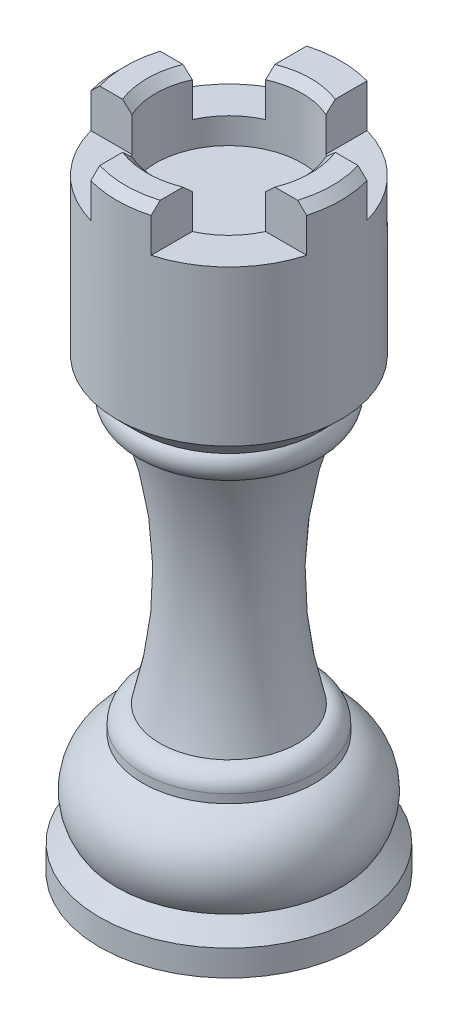
ISO-10303-21;
HEADER;
FILE_DESCRIPTION(('STEP AP214'),'2;1');
FILE_NAME('part.step','',(''),(''),'','','');
FILE_SCHEMA(('AUTOMOTIVE_DESIGN { 1 0 10303 214 1 1 1 1 }'));
ENDSEC;
DATA;
#1=APPLICATION_CONTEXT('core data for automotive mechanical design processes');
#2=APPLICATION_PROTOCOL_DEFINITION('international standard','automotive_design',2000,#1);
#3=PRODUCT_CONTEXT('',#1,'mechanical');
#4=PRODUCT('Part','Part','',(#3));
#5=PRODUCT_RELATED_PRODUCT_CATEGORY('part','',(#4));
#6=PRODUCT_DEFINITION_FORMATION('','',#4);
#7=PRODUCT_DEFINITION_CONTEXT('part definition',#1,'design');
#8=PRODUCT_DEFINITION('design','',#6,#7);
#9=PRODUCT_DEFINITION_SHAPE('','',#8);
#10=(LENGTH_UNIT() NAMED_UNIT(*) SI_UNIT(.MILLI.,.METRE.));
#11=(NAMED_UNIT(*) PLANE_ANGLE_UNIT() SI_UNIT($,.RADIAN.));
#12=(NAMED_UNIT(*) SI_UNIT($,.STERADIAN.) SOLID_ANGLE_UNIT());
#13=UNCERTAINTY_MEASURE_WITH_UNIT(LENGTH_MEASURE(1.E-05),#10,'distance_accuracy_value','');
#14=(GEOMETRIC_REPRESENTATION_CONTEXT(3) GLOBAL_UNCERTAINTY_ASSIGNED_CONTEXT((#13)) GLOBAL_UNIT_ASSIGNED_CONTEXT((#10,
#11,#12)) REPRESENTATION_CONTEXT('',''));
#15=CARTESIAN_POINT('',(0.,0.,0.));
#16=DIRECTION('',(0.,0.,1.));
#17=DIRECTION('',(1.,0.,0.));
#18=AXIS2_PLACEMENT_3D('',#15,#16,#17);
#19=CARTESIAN_POINT('',(-13.,75.,0.));
#20=DIRECTION('',(0.,1.,0.));
#21=DIRECTION('',(0.,0.,1.));
#22=AXIS2_PLACEMENT_3D('',#19,#20,#21);
#23=PLANE('',#22);
#24=DIRECTION('',(1.,0.,0.));
#25=VECTOR('',#24,1.);
#26=CARTESIAN_POINT('',(12.5199840255489,75.,-3.5));
#27=LINE('',#26,#25);
#28=CARTESIAN_POINT('',(8.83176086632786,75.,-3.5));
#29=VERTEX_POINT('',#28);
#30=CARTESIAN_POINT('',(11.478240283249,75.,-3.5));
#31=VERTEX_POINT('',#30);
#32=EDGE_CURVE('E262',#29,#31,#27,.T.);
#33=ORIENTED_EDGE('',*,*,#32,.F.);
#34=CARTESIAN_POINT('',(0.,75.,0.));
#35=DIRECTION('',(0.,1.,0.));
#36=DIRECTION('',(0.,0.,1.));
#37=AXIS2_PLACEMENT_3D('',#34,#35,#36);
#38=CIRCLE('',#37,9.50000000000001);
#39=CARTESIAN_POINT('',(8.83176086632786,75.,3.5));
#40=VERTEX_POINT('',#39);
#41=EDGE_CURVE('E577',#29,#40,#38,.F.);
#42=ORIENTED_EDGE('',*,*,#41,.T.);
#43=DIRECTION('',(-1.,0.,0.));
#44=VECTOR('',#43,1.);
#45=CARTESIAN_POINT('',(7.74596669241484,75.,3.5));
#46=LINE('',#45,#44);
#47=CARTESIAN_POINT('',(11.478240283249,75.,3.5));
#48=VERTEX_POINT('',#47);
#49=EDGE_CURVE('E233',#48,#40,#46,.T.);
#50=ORIENTED_EDGE('',*,*,#49,.F.);
#51=CARTESIAN_POINT('',(0.,75.,0.));
#52=DIRECTION('',(0.,1.,0.));
#53=DIRECTION('',(0.,0.,1.));
#54=AXIS2_PLACEMENT_3D('',#51,#52,#53);
#55=CIRCLE('',#54,12.);
#56=EDGE_CURVE('E413',#48,#31,#55,.T.);
#57=ORIENTED_EDGE('',*,*,#56,.T.);
#58=EDGE_LOOP('',(#33,#42,#50,#57));
#59=FACE_BOUND('',#58,.T.);
#60=ADVANCED_FACE('F34',(#59),#23,.T.);
#61=DIRECTION('',(0.,0.,-1.));
#62=VECTOR('',#61,1.);
#63=CARTESIAN_POINT('',(-3.5,75.,-12.5199840255489));
#64=LINE('',#63,#62);
#65=CARTESIAN_POINT('',(-3.5,75.,-8.83176086632786));
#66=VERTEX_POINT('',#65);
#67=CARTESIAN_POINT('',(-3.5,75.,-12.5199840255489));
#68=VERTEX_POINT('',#67);
#69=EDGE_CURVE('E288',#66,#68,#64,.T.);
#70=ORIENTED_EDGE('',*,*,#69,.F.);
#71=CARTESIAN_POINT('',(0.,75.,0.));
#72=DIRECTION('',(0.,1.,0.));
#73=DIRECTION('',(0.,0.,1.));
#74=AXIS2_PLACEMENT_3D('',#71,#72,#73);
#75=CIRCLE('',#74,9.50000000000001);
#76=CARTESIAN_POINT('',(3.5,75.,-8.83176086632785));
#77=VERTEX_POINT('',#76);
#78=EDGE_CURVE('E448',#66,#77,#75,.F.);
#79=ORIENTED_EDGE('',*,*,#78,.T.);
#80=DIRECTION('',(0.,0.,1.));
#81=VECTOR('',#80,1.);
#82=CARTESIAN_POINT('',(3.5,75.,-12.5199840255489));
#83=LINE('',#82,#81);
#84=CARTESIAN_POINT('',(3.5,75.,-12.5199840255489));
#85=VERTEX_POINT('',#84);
#86=EDGE_CURVE('E270',#85,#77,#83,.T.);
#87=ORIENTED_EDGE('',*,*,#86,.F.);
#88=CARTESIAN_POINT('',(0.,75.,0.));
#89=DIRECTION('',(0.,1.,0.));
#90=DIRECTION('',(0.,0.,1.));
#91=AXIS2_PLACEMENT_3D('',#88,#89,#90);
#92=CIRCLE('',#91,13.);
#93=EDGE_CURVE('E337',#85,#68,#92,.T.);
#94=ORIENTED_EDGE('',*,*,#93,.T.);
#95=EDGE_LOOP('',(#70,#79,#87,#94));
#96=FACE_BOUND('',#95,.T.);
#97=ADVANCED_FACE('F552',(#96),#23,.T.);
#98=DIRECTION('',(-1.,0.,0.));
#99=VECTOR('',#98,1.);
#100=CARTESIAN_POINT('',(-12.5199840255489,75.,3.5));
#101=LINE('',#100,#99);
#102=CARTESIAN_POINT('',(-8.83176086632787,75.,3.5));
#103=VERTEX_POINT('',#102);
#104=CARTESIAN_POINT('',(-11.478240283249,75.,3.5));
#105=VERTEX_POINT('',#104);
#106=EDGE_CURVE('E216',#103,#105,#101,.T.);
#107=ORIENTED_EDGE('',*,*,#106,.F.);
#108=CARTESIAN_POINT('',(0.,75.,0.));
#109=DIRECTION('',(0.,1.,0.));
#110=DIRECTION('',(0.,0.,1.));
#111=AXIS2_PLACEMENT_3D('',#108,#109,#110);
#112=CIRCLE('',#111,9.50000000000002);
#113=CARTESIAN_POINT('',(-8.83176086632787,75.,-3.5));
#114=VERTEX_POINT('',#113);
#115=EDGE_CURVE('E55',#103,#114,#112,.F.);
#116=ORIENTED_EDGE('',*,*,#115,.T.);
#117=DIRECTION('',(1.,0.,0.));
#118=VECTOR('',#117,1.);
#119=CARTESIAN_POINT('',(-12.5199840255489,75.,-3.5));
#120=LINE('',#119,#118);
#121=CARTESIAN_POINT('',(-11.478240283249,75.,-3.5));
#122=VERTEX_POINT('',#121);
#123=EDGE_CURVE('E296',#122,#114,#120,.T.);
#124=ORIENTED_EDGE('',*,*,#123,.F.);
#125=CARTESIAN_POINT('',(0.,75.,0.));
#126=DIRECTION('',(0.,1.,0.));
#127=DIRECTION('',(0.,0.,1.));
#128=AXIS2_PLACEMENT_3D('',#125,#126,#127);
#129=CIRCLE('',#128,12.);
#130=EDGE_CURVE('E470',#122,#105,#129,.T.);
#131=ORIENTED_EDGE('',*,*,#130,.T.);
#132=EDGE_LOOP('',(#107,#116,#124,#131));
#133=FACE_BOUND('',#132,.T.);
#134=ADVANCED_FACE('F537',(#133),#23,.T.);
#135=CARTESIAN_POINT('',(0.,67.,0.));
#136=DIRECTION('',(0.,1.,0.));
#137=DIRECTION('',(0.,0.,1.));
#138=AXIS2_PLACEMENT_3D('',#135,#136,#137);
#139=PLANE('',#138);
#140=CARTESIAN_POINT('',(0.,67.,0.));
#141=DIRECTION('',(0.,1.,0.));
#142=DIRECTION('',(0.,0.,1.));
#143=AXIS2_PLACEMENT_3D('',#140,#141,#142);
#144=CIRCLE('',#143,8.50000000000001);
#145=CARTESIAN_POINT('',(0.,67.,8.50000000000001));
#146=VERTEX_POINT('',#145);
#147=EDGE_CURVE('E340',#146,#146,#144,.T.);
#148=ORIENTED_EDGE('',*,*,#147,.T.);
#149=EDGE_LOOP('',(#148));
#150=FACE_BOUND('',#149,.T.);
#151=ADVANCED_FACE('F605',(#150),#139,.T.);
#152=CARTESIAN_POINT('',(0.,78.146546409638,0.));
#153=DIRECTION('',(0.,1.,0.));
#154=DIRECTION('',(0.,0.,1.));
#155=AXIS2_PLACEMENT_3D('',#152,#153,#154);
#156=CYLINDRICAL_SURFACE('',#155,8.50000000000001);
#157=DIRECTION('',(0.,1.,0.));
#158=VECTOR('',#157,1.);
#159=CARTESIAN_POINT('',(-3.5,70.,7.74596669241483));
#160=LINE('',#159,#158);
#161=CARTESIAN_POINT('',(-3.5,70.,7.74596669241483));
#162=VERTEX_POINT('',#161);
#163=CARTESIAN_POINT('',(-3.5,74.,7.74596669241483));
#164=VERTEX_POINT('',#163);
#165=EDGE_CURVE('E203',#162,#164,#160,.T.);
#166=ORIENTED_EDGE('',*,*,#165,.T.);
#167=CARTESIAN_POINT('',(0.,74.,0.));
#168=DIRECTION('',(0.,1.,0.));
#169=DIRECTION('',(0.,0.,1.));
#170=AXIS2_PLACEMENT_3D('',#167,#168,#169);
#171=CIRCLE('',#170,8.50000000000001);
#172=CARTESIAN_POINT('',(3.5,74.,7.74596669241483));
#173=VERTEX_POINT('',#172);
#174=EDGE_CURVE('E352',#164,#173,#171,.T.);
#175=ORIENTED_EDGE('',*,*,#174,.T.);
#176=DIRECTION('',(0.,1.,0.));
#177=VECTOR('',#176,1.);
#178=CARTESIAN_POINT('',(3.5,70.,7.74596669241483));
#179=LINE('',#178,#177);
#180=CARTESIAN_POINT('',(3.5,70.,7.74596669241483));
#181=VERTEX_POINT('',#180);
#182=EDGE_CURVE('E240',#181,#173,#179,.T.);
#183=ORIENTED_EDGE('',*,*,#182,.F.);
#184=CARTESIAN_POINT('',(0.,70.,0.));
#185=DIRECTION('',(0.,-1.,0.));
#186=DIRECTION('',(0.,0.,1.));
#187=AXIS2_PLACEMENT_3D('',#184,#185,#186);
#188=CIRCLE('',#187,8.5);
#189=CARTESIAN_POINT('',(7.74596669241484,70.,3.5));
#190=VERTEX_POINT('',#189);
#191=EDGE_CURVE('E229',#190,#181,#188,.T.);
#192=ORIENTED_EDGE('',*,*,#191,.F.);
#193=DIRECTION('',(0.,1.,0.));
#194=VECTOR('',#193,1.);
#195=CARTESIAN_POINT('',(7.74596669241484,70.,3.5));
#196=LINE('',#195,#194);
#197=CARTESIAN_POINT('',(7.74596669241484,74.,3.5));
#198=VERTEX_POINT('',#197);
#199=EDGE_CURVE('E247',#190,#198,#196,.T.);
#200=ORIENTED_EDGE('',*,*,#199,.T.);
#201=CARTESIAN_POINT('',(0.,74.,0.));
#202=DIRECTION('',(0.,1.,0.));
#203=DIRECTION('',(0.,0.,1.));
#204=AXIS2_PLACEMENT_3D('',#201,#202,#203);
#205=CIRCLE('',#204,8.50000000000001);
#206=CARTESIAN_POINT('',(7.74596669241483,74.,-3.5));
#207=VERTEX_POINT('',#206);
#208=EDGE_CURVE('E349',#198,#207,#205,.T.);
#209=ORIENTED_EDGE('',*,*,#208,.T.);
#210=DIRECTION('',(0.,1.,0.));
#211=VECTOR('',#210,1.);
#212=CARTESIAN_POINT('',(7.74596669241483,70.,-3.5));
#213=LINE('',#212,#211);
#214=CARTESIAN_POINT('',(7.74596669241483,70.,-3.5));
#215=VERTEX_POINT('',#214);
#216=EDGE_CURVE('E277',#215,#207,#213,.T.);
#217=ORIENTED_EDGE('',*,*,#216,.F.);
#218=CARTESIAN_POINT('',(0.,70.,0.));
#219=DIRECTION('',(0.,-1.,0.));
#220=DIRECTION('',(0.,0.,1.));
#221=AXIS2_PLACEMENT_3D('',#218,#219,#220);
#222=CIRCLE('',#221,8.5);
#223=CARTESIAN_POINT('',(3.5,70.,-7.74596669241483));
#224=VERTEX_POINT('',#223);
#225=EDGE_CURVE('E265',#224,#215,#222,.T.);
#226=ORIENTED_EDGE('',*,*,#225,.F.);
#227=DIRECTION('',(0.,1.,0.));
#228=VECTOR('',#227,1.);
#229=CARTESIAN_POINT('',(3.5,70.,-7.74596669241483));
#230=LINE('',#229,#228);
#231=CARTESIAN_POINT('',(3.5,74.,-7.74596669241483));
#232=VERTEX_POINT('',#231);
#233=EDGE_CURVE('E280',#224,#232,#230,.T.);
#234=ORIENTED_EDGE('',*,*,#233,.T.);
#235=CARTESIAN_POINT('',(0.,74.,0.));
#236=DIRECTION('',(0.,1.,0.));
#237=DIRECTION('',(0.,0.,1.));
#238=AXIS2_PLACEMENT_3D('',#235,#236,#237);
#239=CIRCLE('',#238,8.50000000000001);
#240=CARTESIAN_POINT('',(-3.5,74.,-7.74596669241483));
#241=VERTEX_POINT('',#240);
#242=EDGE_CURVE('E346',#232,#241,#239,.T.);
#243=ORIENTED_EDGE('',*,*,#242,.T.);
#244=DIRECTION('',(0.,1.,0.));
#245=VECTOR('',#244,1.);
#246=CARTESIAN_POINT('',(-3.5,70.,-7.74596669241483));
#247=LINE('',#246,#245);
#248=CARTESIAN_POINT('',(-3.5,70.,-7.74596669241483));
#249=VERTEX_POINT('',#248);
#250=EDGE_CURVE('E304',#249,#241,#247,.T.);
#251=ORIENTED_EDGE('',*,*,#250,.F.);
#252=CARTESIAN_POINT('',(0.,70.,0.));
#253=DIRECTION('',(0.,-1.,0.));
#254=DIRECTION('',(0.,0.,1.));
#255=AXIS2_PLACEMENT_3D('',#252,#253,#254);
#256=CIRCLE('',#255,8.5);
#257=CARTESIAN_POINT('',(-7.74596669241483,70.,-3.5));
#258=VERTEX_POINT('',#257);
#259=EDGE_CURVE('E291',#258,#249,#256,.T.);
#260=ORIENTED_EDGE('',*,*,#259,.F.);
#261=DIRECTION('',(0.,1.,0.));
#262=VECTOR('',#261,1.);
#263=CARTESIAN_POINT('',(-7.74596669241483,70.,-3.5));
#264=LINE('',#263,#262);
#265=CARTESIAN_POINT('',(-7.74596669241483,74.,-3.5));
#266=VERTEX_POINT('',#265);
#267=EDGE_CURVE('E307',#258,#266,#264,.T.);
#268=ORIENTED_EDGE('',*,*,#267,.T.);
#269=CARTESIAN_POINT('',(0.,74.,0.));
#270=DIRECTION('',(0.,1.,0.));
#271=DIRECTION('',(0.,0.,1.));
#272=AXIS2_PLACEMENT_3D('',#269,#270,#271);
#273=CIRCLE('',#272,8.50000000000001);
#274=CARTESIAN_POINT('',(-7.74596669241484,74.,3.5));
#275=VERTEX_POINT('',#274);
#276=EDGE_CURVE('E343',#266,#275,#273,.T.);
#277=ORIENTED_EDGE('',*,*,#276,.T.);
#278=DIRECTION('',(0.,1.,0.));
#279=VECTOR('',#278,1.);
#280=CARTESIAN_POINT('',(-7.74596669241484,70.,3.5));
#281=LINE('',#280,#279);
#282=CARTESIAN_POINT('',(-7.74596669241484,70.,3.5));
#283=VERTEX_POINT('',#282);
#284=EDGE_CURVE('E224',#283,#275,#281,.T.);
#285=ORIENTED_EDGE('',*,*,#284,.F.);
#286=CARTESIAN_POINT('',(0.,70.,0.));
#287=DIRECTION('',(0.,-1.,0.));
#288=DIRECTION('',(0.,0.,1.));
#289=AXIS2_PLACEMENT_3D('',#286,#287,#288);
#290=CIRCLE('',#289,8.5);
#291=EDGE_CURVE('E206',#162,#283,#290,.T.);
#292=ORIENTED_EDGE('',*,*,#291,.F.);
#293=EDGE_LOOP('',(#166,#175,#183,#192,#200,#209,#217,#226,#234,#243,#251,#260,#268,#277,#285,#292));
#294=FACE_BOUND('',#293,.T.);
#295=ORIENTED_EDGE('',*,*,#147,.F.);
#296=EDGE_LOOP('',(#295));
#297=FACE_BOUND('',#296,.T.);
#298=ADVANCED_FACE('F523',(#294,#297),#156,.F.);
#299=DIRECTION('',(0.,0.,1.));
#300=VECTOR('',#299,1.);
#301=CARTESIAN_POINT('',(3.5,75.,12.5199840255489));
#302=LINE('',#301,#300);
#303=CARTESIAN_POINT('',(3.5,75.,8.83176086632785));
#304=VERTEX_POINT('',#303);
#305=CARTESIAN_POINT('',(3.5,75.,11.478240283249));
#306=VERTEX_POINT('',#305);
#307=EDGE_CURVE('E241',#304,#306,#302,.T.);
#308=ORIENTED_EDGE('',*,*,#307,.F.);
#309=CARTESIAN_POINT('',(0.,75.,0.));
#310=DIRECTION('',(0.,1.,0.));
#311=DIRECTION('',(0.,0.,1.));
#312=AXIS2_PLACEMENT_3D('',#309,#310,#311);
#313=CIRCLE('',#312,9.50000000000001);
#314=CARTESIAN_POINT('',(-3.5,75.,8.83176086632786));
#315=VERTEX_POINT('',#314);
#316=EDGE_CURVE('E510',#304,#315,#313,.F.);
#317=ORIENTED_EDGE('',*,*,#316,.T.);
#318=DIRECTION('',(0.,0.,-1.));
#319=VECTOR('',#318,1.);
#320=CARTESIAN_POINT('',(-3.5,75.,12.5199840255489));
#321=LINE('',#320,#319);
#322=CARTESIAN_POINT('',(-3.5,75.,11.478240283249));
#323=VERTEX_POINT('',#322);
#324=EDGE_CURVE('E250',#323,#315,#321,.T.);
#325=ORIENTED_EDGE('',*,*,#324,.F.);
#326=CARTESIAN_POINT('',(0.,75.,0.));
#327=DIRECTION('',(0.,1.,0.));
#328=DIRECTION('',(0.,0.,1.));
#329=AXIS2_PLACEMENT_3D('',#326,#327,#328);
#330=CIRCLE('',#329,12.);
#331=EDGE_CURVE('E512',#323,#306,#330,.T.);
#332=ORIENTED_EDGE('',*,*,#331,.T.);
#333=EDGE_LOOP('',(#308,#317,#325,#332));
#334=FACE_BOUND('',#333,.T.);
#335=ADVANCED_FACE('F521',(#334),#23,.T.);
#336=CARTESIAN_POINT('',(0.,78.146546409638,0.));
#337=DIRECTION('',(0.,1.,0.));
#338=DIRECTION('',(0.,0.,1.));
#339=AXIS2_PLACEMENT_3D('',#336,#337,#338);
#340=CYLINDRICAL_SURFACE('',#339,13.);
#341=DIRECTION('',(0.,1.,0.));
#342=VECTOR('',#341,1.);
#343=CARTESIAN_POINT('',(3.5,70.,12.5199840255489));
#344=LINE('',#343,#342);
#345=CARTESIAN_POINT('',(3.5,70.,12.5199840255489));
#346=VERTEX_POINT('',#345);
#347=CARTESIAN_POINT('',(3.5,74.,12.5199840255489));
#348=VERTEX_POINT('',#347);
#349=EDGE_CURVE('E254',#346,#348,#344,.T.);
#350=ORIENTED_EDGE('',*,*,#349,.T.);
#351=CARTESIAN_POINT('',(0.,74.,0.));
#352=DIRECTION('',(0.,1.,0.));
#353=DIRECTION('',(0.,0.,1.));
#354=AXIS2_PLACEMENT_3D('',#351,#352,#353);
#355=CIRCLE('',#354,13.);
#356=CARTESIAN_POINT('',(-3.5,74.,12.5199840255489));
#357=VERTEX_POINT('',#356);
#358=EDGE_CURVE('E222',#348,#357,#355,.F.);
#359=ORIENTED_EDGE('',*,*,#358,.T.);
#360=DIRECTION('',(0.,1.,0.));
#361=VECTOR('',#360,1.);
#362=CARTESIAN_POINT('',(-3.5,70.,12.5199840255489));
#363=LINE('',#362,#361);
#364=CARTESIAN_POINT('',(-3.5,70.,12.5199840255489));
#365=VERTEX_POINT('',#364);
#366=EDGE_CURVE('E200',#365,#357,#363,.T.);
#367=ORIENTED_EDGE('',*,*,#366,.F.);
#368=CARTESIAN_POINT('',(0.,70.,0.));
#369=DIRECTION('',(0.,1.,0.));
#370=DIRECTION('',(0.,0.,1.));
#371=AXIS2_PLACEMENT_3D('',#368,#369,#370);
#372=CIRCLE('',#371,13.);
#373=CARTESIAN_POINT('',(-12.5199840255489,70.,3.5));
#374=VERTEX_POINT('',#373);
#375=EDGE_CURVE('E207',#374,#365,#372,.T.);
#376=ORIENTED_EDGE('',*,*,#375,.F.);
#377=DIRECTION('',(0.,1.,0.));
#378=VECTOR('',#377,1.);
#379=CARTESIAN_POINT('',(-12.5199840255489,70.,3.5));
#380=LINE('',#379,#378);
#381=CARTESIAN_POINT('',(-12.5199840255489,74.,3.5));
#382=VERTEX_POINT('',#381);
#383=EDGE_CURVE('E298',#374,#382,#380,.T.);
#384=ORIENTED_EDGE('',*,*,#383,.T.);
#385=CARTESIAN_POINT('',(0.,74.,0.));
#386=DIRECTION('',(0.,1.,0.));
#387=DIRECTION('',(0.,0.,1.));
#388=AXIS2_PLACEMENT_3D('',#385,#386,#387);
#389=CIRCLE('',#388,13.);
#390=CARTESIAN_POINT('',(-12.5199840255489,74.,-3.5));
#391=VERTEX_POINT('',#390);
#392=EDGE_CURVE('E430',#382,#391,#389,.F.);
#393=ORIENTED_EDGE('',*,*,#392,.T.);
#394=DIRECTION('',(0.,1.,0.));
#395=VECTOR('',#394,1.);
#396=CARTESIAN_POINT('',(-12.5199840255489,70.,-3.5));
#397=LINE('',#396,#395);
#398=CARTESIAN_POINT('',(-12.5199840255489,70.,-3.5));
#399=VERTEX_POINT('',#398);
#400=EDGE_CURVE('E295',#399,#391,#397,.T.);
#401=ORIENTED_EDGE('',*,*,#400,.F.);
#402=CARTESIAN_POINT('',(0.,70.,0.));
#403=DIRECTION('',(0.,1.,0.));
#404=DIRECTION('',(0.,0.,1.));
#405=AXIS2_PLACEMENT_3D('',#402,#403,#404);
#406=CIRCLE('',#405,13.);
#407=CARTESIAN_POINT('',(-3.50000000000001,70.,-12.5199840255489));
#408=VERTEX_POINT('',#407);
#409=EDGE_CURVE('E284',#408,#399,#406,.T.);
#410=ORIENTED_EDGE('',*,*,#409,.F.);
#411=DIRECTION('',(0.,1.,0.));
#412=VECTOR('',#411,1.);
#413=CARTESIAN_POINT('',(-3.5,70.,-12.5199840255489));
#414=LINE('',#413,#412);
#415=EDGE_CURVE('E300',#408,#68,#414,.T.);
#416=ORIENTED_EDGE('',*,*,#415,.T.);
#417=ORIENTED_EDGE('',*,*,#93,.F.);
#418=DIRECTION('',(0.,1.,0.));
#419=VECTOR('',#418,1.);
#420=CARTESIAN_POINT('',(3.5,70.,-12.5199840255489));
#421=LINE('',#420,#419);
#422=CARTESIAN_POINT('',(3.5,70.,-12.5199840255489));
#423=VERTEX_POINT('',#422);
#424=EDGE_CURVE('E269',#423,#85,#421,.T.);
#425=ORIENTED_EDGE('',*,*,#424,.F.);
#426=CARTESIAN_POINT('',(0.,70.,0.));
#427=DIRECTION('',(0.,1.,0.));
#428=DIRECTION('',(0.,0.,1.));
#429=AXIS2_PLACEMENT_3D('',#426,#427,#428);
#430=CIRCLE('',#429,13.);
#431=CARTESIAN_POINT('',(12.5199840255489,70.,-3.50000000000001));
#432=VERTEX_POINT('',#431);
#433=EDGE_CURVE('E258',#432,#423,#430,.T.);
#434=ORIENTED_EDGE('',*,*,#433,.F.);
#435=DIRECTION('',(0.,1.,0.));
#436=VECTOR('',#435,1.);
#437=CARTESIAN_POINT('',(12.5199840255489,70.,-3.5));
#438=LINE('',#437,#436);
#439=CARTESIAN_POINT('',(12.5199840255489,74.,-3.5));
#440=VERTEX_POINT('',#439);
#441=EDGE_CURVE('E244',#432,#440,#438,.T.);
#442=ORIENTED_EDGE('',*,*,#441,.T.);
#443=CARTESIAN_POINT('',(0.,74.,0.));
#444=DIRECTION('',(0.,1.,0.));
#445=DIRECTION('',(0.,0.,1.));
#446=AXIS2_PLACEMENT_3D('',#443,#444,#445);
#447=CIRCLE('',#446,13.);
#448=CARTESIAN_POINT('',(12.5199840255489,74.,3.5));
#449=VERTEX_POINT('',#448);
#450=EDGE_CURVE('E437',#440,#449,#447,.F.);
#451=ORIENTED_EDGE('',*,*,#450,.T.);
#452=DIRECTION('',(0.,1.,0.));
#453=VECTOR('',#452,1.);
#454=CARTESIAN_POINT('',(12.5199840255489,70.,3.5));
#455=LINE('',#454,#453);
#456=CARTESIAN_POINT('',(12.5199840255489,70.,3.5));
#457=VERTEX_POINT('',#456);
#458=EDGE_CURVE('E251',#457,#449,#455,.T.);
#459=ORIENTED_EDGE('',*,*,#458,.F.);
#460=CARTESIAN_POINT('',(0.,70.,0.));
#461=DIRECTION('',(0.,1.,0.));
#462=DIRECTION('',(0.,0.,1.));
#463=AXIS2_PLACEMENT_3D('',#460,#461,#462);
#464=CIRCLE('',#463,13.);
#465=EDGE_CURVE('E235',#346,#457,#464,.T.);
#466=ORIENTED_EDGE('',*,*,#465,.F.);
#467=EDGE_LOOP('',(#350,#359,#367,#376,#384,#393,#401,#410,#416,#417,#425,#434,#442,#451,#459,#466));
#468=FACE_BOUND('',#467,.T.);
#469=CARTESIAN_POINT('',(0.,52.,0.));
#470=DIRECTION('',(0.,1.,0.));
#471=DIRECTION('',(0.,0.,1.));
#472=AXIS2_PLACEMENT_3D('',#469,#470,#471);
#473=CIRCLE('',#472,13.);
#474=CARTESIAN_POINT('',(0.,52.,13.));
#475=VERTEX_POINT('',#474);
#476=EDGE_CURVE('E334',#475,#475,#473,.T.);
#477=ORIENTED_EDGE('',*,*,#476,.T.);
#478=EDGE_LOOP('',(#477));
#479=FACE_BOUND('',#478,.T.);
#480=ADVANCED_FACE('F219',(#468,#479),#340,.T.);
#481=CARTESIAN_POINT('',(0.,52.,0.));
#482=DIRECTION('',(0.,1.,0.));
#483=DIRECTION('',(0.,0.,1.));
#484=AXIS2_PLACEMENT_3D('',#481,#482,#483);
#485=CONICAL_SURFACE('',#484,13.,0.785398163397448);
#486=CARTESIAN_POINT('',(0.,49.5,0.));
#487=DIRECTION('',(0.,1.,0.));
#488=DIRECTION('',(0.,0.,1.));
#489=AXIS2_PLACEMENT_3D('',#486,#487,#488);
#490=CIRCLE('',#489,10.5);
#491=CARTESIAN_POINT('',(0.,49.5,10.5));
#492=VERTEX_POINT('',#491);
#493=EDGE_CURVE('E331',#492,#492,#490,.T.);
#494=ORIENTED_EDGE('',*,*,#493,.T.);
#495=EDGE_LOOP('',(#494));
#496=FACE_BOUND('',#495,.T.);
#497=ORIENTED_EDGE('',*,*,#476,.F.);
#498=EDGE_LOOP('',(#497));
#499=FACE_BOUND('',#498,.T.);
#500=ADVANCED_FACE('F604',(#496,#499),#485,.T.);
#501=CARTESIAN_POINT('',(0.,48.1771243444677,0.));
#502=DIRECTION('',(0.,1.,0.));
#503=DIRECTION('',(0.,0.,1.));
#504=AXIS2_PLACEMENT_3D('',#501,#502,#503);
#505=TOROIDAL_SURFACE('',#504,9.,2.);
#506=CARTESIAN_POINT('',(0.,46.18,0.));
#507=DIRECTION('',(0.,1.,0.));
#508=DIRECTION('',(0.,0.,1.));
#509=AXIS2_PLACEMENT_3D('',#506,#507,#508);
#510=CIRCLE('',#509,8.89278828079716);
#511=CARTESIAN_POINT('',(0.,46.18,8.89278828079716));
#512=VERTEX_POINT('',#511);
#513=EDGE_CURVE('E328',#512,#512,#510,.T.);
#514=ORIENTED_EDGE('',*,*,#513,.T.);
#515=EDGE_LOOP('',(#514));
#516=FACE_BOUND('',#515,.T.);
#517=ORIENTED_EDGE('',*,*,#493,.F.);
#518=EDGE_LOOP('',(#517));
#519=FACE_BOUND('',#518,.T.);
#520=ADVANCED_FACE('F819',(#516,#519),#505,.T.);
#521=CARTESIAN_POINT('',(0.,30.1141714007261,0.));
#522=DIRECTION('',(0.,1.,0.));
#523=DIRECTION('',(0.,0.,1.));
#524=AXIS2_PLACEMENT_3D('',#521,#522,#523);
#525=TOROIDAL_SURFACE('',#524,56.2413801439007,50.);
#526=CARTESIAN_POINT('',(0.,16.97,0.));
#527=DIRECTION('',(0.,1.,0.));
#528=DIRECTION('',(0.,0.,1.));
#529=AXIS2_PLACEMENT_3D('',#526,#527,#528);
#530=CIRCLE('',#529,8.);
#531=CARTESIAN_POINT('',(0.,16.97,8.));
#532=VERTEX_POINT('',#531);
#533=EDGE_CURVE('E325',#532,#532,#530,.T.);
#534=ORIENTED_EDGE('',*,*,#533,.T.);
#535=EDGE_LOOP('',(#534));
#536=FACE_BOUND('',#535,.T.);
#537=ORIENTED_EDGE('',*,*,#513,.F.);
#538=EDGE_LOOP('',(#537));
#539=FACE_BOUND('',#538,.T.);
#540=ADVANCED_FACE('F810',(#536,#539),#525,.F.);
#541=CARTESIAN_POINT('',(0.,14.97,0.));
#542=DIRECTION('',(0.,1.,0.));
#543=DIRECTION('',(0.,0.,1.));
#544=AXIS2_PLACEMENT_3D('',#541,#542,#543);
#545=TOROIDAL_SURFACE('',#544,8.,2.);
#546=CARTESIAN_POINT('',(0.,14.97,0.));
#547=DIRECTION('',(0.,1.,0.));
#548=DIRECTION('',(0.,0.,1.));
#549=AXIS2_PLACEMENT_3D('',#546,#547,#548);
#550=CIRCLE('',#549,10.);
#551=CARTESIAN_POINT('',(0.,14.97,10.));
#552=VERTEX_POINT('',#551);
#553=EDGE_CURVE('E322',#552,#552,#550,.T.);
#554=ORIENTED_EDGE('',*,*,#553,.T.);
#555=EDGE_LOOP('',(#554));
#556=FACE_BOUND('',#555,.T.);
#557=ORIENTED_EDGE('',*,*,#533,.F.);
#558=EDGE_LOOP('',(#557));
#559=FACE_BOUND('',#558,.T.);
#560=ADVANCED_FACE('F801',(#556,#559),#545,.T.);
#561=CARTESIAN_POINT('',(0.,78.146546409638,0.));
#562=DIRECTION('',(0.,1.,0.));
#563=DIRECTION('',(0.,0.,1.));
#564=AXIS2_PLACEMENT_3D('',#561,#562,#563);
#565=CYLINDRICAL_SURFACE('',#564,10.);
#566=CARTESIAN_POINT('',(0.,13.97,0.));
#567=DIRECTION('',(0.,1.,0.));
#568=DIRECTION('',(0.,0.,1.));
#569=AXIS2_PLACEMENT_3D('',#566,#567,#568);
#570=CIRCLE('',#569,10.);
#571=CARTESIAN_POINT('',(0.,13.97,10.));
#572=VERTEX_POINT('',#571);
#573=EDGE_CURVE('E319',#572,#572,#570,.T.);
#574=ORIENTED_EDGE('',*,*,#573,.T.);
#575=EDGE_LOOP('',(#574));
#576=FACE_BOUND('',#575,.T.);
#577=ORIENTED_EDGE('',*,*,#553,.F.);
#578=EDGE_LOOP('',(#577));
#579=FACE_BOUND('',#578,.T.);
#580=ADVANCED_FACE('F792',(#576,#579),#565,.T.);
#581=CARTESIAN_POINT('',(0.,8.31380661428568,0.));
#582=DIRECTION('',(0.,1.,0.));
#583=DIRECTION('',(0.,0.,1.));
#584=AXIS2_PLACEMENT_3D('',#581,#582,#583);
#585=TOROIDAL_SURFACE('',#584,7.99813177671417,6.);
#586=CARTESIAN_POINT('',(0.,5.,0.));
#587=DIRECTION('',(0.,1.,0.));
#588=DIRECTION('',(0.,0.,1.));
#589=AXIS2_PLACEMENT_3D('',#586,#587,#588);
#590=CIRCLE('',#589,13.);
#591=CARTESIAN_POINT('',(0.,5.,13.));
#592=VERTEX_POINT('',#591);
#593=EDGE_CURVE('E316',#592,#592,#590,.T.);
#594=ORIENTED_EDGE('',*,*,#593,.T.);
#595=EDGE_LOOP('',(#594));
#596=FACE_BOUND('',#595,.T.);
#597=ORIENTED_EDGE('',*,*,#573,.F.);
#598=EDGE_LOOP('',(#597));
#599=FACE_BOUND('',#598,.T.);
#600=ADVANCED_FACE('F783',(#596,#599),#585,.T.);
#601=CARTESIAN_POINT('',(0.,5.,0.));
#602=DIRECTION('',(0.,-1.,0.));
#603=DIRECTION('',(0.,0.,-1.));
#604=AXIS2_PLACEMENT_3D('',#601,#602,#603);
#605=CONICAL_SURFACE('',#604,13.,0.785398163397444);
#606=CARTESIAN_POINT('',(0.,3.,0.));
#607=DIRECTION('',(0.,1.,0.));
#608=DIRECTION('',(0.,0.,1.));
#609=AXIS2_PLACEMENT_3D('',#606,#607,#608);
#610=CIRCLE('',#609,15.);
#611=CARTESIAN_POINT('',(0.,3.,15.));
#612=VERTEX_POINT('',#611);
#613=EDGE_CURVE('E313',#612,#612,#610,.T.);
#614=ORIENTED_EDGE('',*,*,#613,.T.);
#615=EDGE_LOOP('',(#614));
#616=FACE_BOUND('',#615,.T.);
#617=ORIENTED_EDGE('',*,*,#593,.F.);
#618=EDGE_LOOP('',(#617));
#619=FACE_BOUND('',#618,.T.);
#620=ADVANCED_FACE('F775',(#616,#619),#605,.T.);
#621=CARTESIAN_POINT('',(0.,78.146546409638,0.));
#622=DIRECTION('',(0.,1.,0.));
#623=DIRECTION('',(0.,0.,1.));
#624=AXIS2_PLACEMENT_3D('',#621,#622,#623);
#625=CYLINDRICAL_SURFACE('',#624,15.);
#626=CARTESIAN_POINT('',(0.,0.,0.));
#627=DIRECTION('',(0.,1.,0.));
#628=DIRECTION('',(0.,0.,1.));
#629=AXIS2_PLACEMENT_3D('',#626,#627,#628);
#630=CIRCLE('',#629,15.);
#631=CARTESIAN_POINT('',(0.,0.,15.));
#632=VERTEX_POINT('',#631);
#633=EDGE_CURVE('E303',#632,#632,#630,.T.);
#634=ORIENTED_EDGE('',*,*,#633,.T.);
#635=EDGE_LOOP('',(#634));
#636=FACE_BOUND('',#635,.T.);
#637=ORIENTED_EDGE('',*,*,#613,.F.);
#638=EDGE_LOOP('',(#637));
#639=FACE_BOUND('',#638,.T.);
#640=ADVANCED_FACE('F766',(#636,#639),#625,.T.);
#641=CARTESIAN_POINT('',(0.,0.,0.));
#642=DIRECTION('',(0.,-1.,0.));
#643=DIRECTION('',(0.,0.,-1.));
#644=AXIS2_PLACEMENT_3D('',#641,#642,#643);
#645=PLANE('',#644);
#646=ORIENTED_EDGE('',*,*,#633,.F.);
#647=EDGE_LOOP('',(#646));
#648=FACE_BOUND('',#647,.T.);
#649=ADVANCED_FACE('F456',(#648),#645,.T.);
#650=CARTESIAN_POINT('',(-3.5,70.,-12.5199840255489));
#651=DIRECTION('',(1.,0.,0.));
#652=DIRECTION('',(0.,0.,-1.));
#653=AXIS2_PLACEMENT_3D('',#650,#651,#652);
#654=PLANE('',#653);
#655=ORIENTED_EDGE('',*,*,#250,.T.);
#656=CARTESIAN_POINT('',(-3.5,74.,-7.74596669241484));
#657=CARTESIAN_POINT('',(-3.5,74.0828564117491,-7.8368878148491));
#658=CARTESIAN_POINT('',(-3.5,74.165846916953,-7.92768661849454));
#659=CARTESIAN_POINT('',(-3.5,74.332072940303,-8.10905866636408));
#660=CARTESIAN_POINT('',(-3.5,74.4153084569402,-8.19963191197085));
#661=CARTESIAN_POINT('',(-3.5,74.5820022682012,-8.38057295218237));
#662=CARTESIAN_POINT('',(-3.5,74.6654605626114,-8.47094074698394));
#663=CARTESIAN_POINT('',(-3.5,74.8325817009755,-8.65148804059863));
#664=CARTESIAN_POINT('',(-3.5,74.9162445461828,-8.74166753825166));
#665=CARTESIAN_POINT('',(-3.5,75.,-8.83176086632786));
#666=B_SPLINE_CURVE_WITH_KNOTS('',3,(#656,#657,#658,#659,#660,#661,#662,#663,#664,#665),
.UNSPECIFIED.,.F.,.F.,(4,2,2,2,4),(0.,0.369034316328236,0.738066364879933,1.10709805976027,
1.47613202153257),.UNSPECIFIED.);
#667=EDGE_CURVE('E440',#241,#66,#666,.T.);
#668=ORIENTED_EDGE('',*,*,#667,.T.);
#669=ORIENTED_EDGE('',*,*,#69,.T.);
#670=ORIENTED_EDGE('',*,*,#415,.F.);
#671=DIRECTION('',(0.,0.,-1.));
#672=VECTOR('',#671,1.);
#673=CARTESIAN_POINT('',(-3.5,70.,-12.5199840255489));
#674=LINE('',#673,#672);
#675=EDGE_CURVE('E293',#249,#408,#674,.T.);
#676=ORIENTED_EDGE('',*,*,#675,.F.);
#677=EDGE_LOOP('',(#655,#668,#669,#670,#676));
#678=FACE_BOUND('',#677,.T.);
#679=ADVANCED_FACE('F452',(#678),#654,.F.);
#680=CARTESIAN_POINT('',(-12.5199840255489,70.,-3.5));
#681=DIRECTION('',(0.,0.,1.));
#682=DIRECTION('',(1.,0.,0.));
#683=AXIS2_PLACEMENT_3D('',#680,#681,#682);
#684=PLANE('',#683);
#685=ORIENTED_EDGE('',*,*,#123,.T.);
#686=CARTESIAN_POINT('',(-8.83176086632786,75.,-3.5));
#687=CARTESIAN_POINT('',(-8.74166753825167,74.9162445461828,-3.5));
#688=CARTESIAN_POINT('',(-8.65148804059863,74.8325817009755,-3.5));
#689=CARTESIAN_POINT('',(-8.47094074698396,74.6654605626114,-3.5));
#690=CARTESIAN_POINT('',(-8.38057295218239,74.5820022682012,-3.5));
#691=CARTESIAN_POINT('',(-8.19963191197086,74.4153084569402,-3.5));
#692=CARTESIAN_POINT('',(-8.10905866636409,74.332072940303,-3.5));
#693=CARTESIAN_POINT('',(-7.92768661849454,74.1658469169531,-3.5));
#694=CARTESIAN_POINT('',(-7.8368878148491,74.0828564117491,-3.5));
#695=CARTESIAN_POINT('',(-7.74596669241485,74.,-3.5));
#696=B_SPLINE_CURVE_WITH_KNOTS('',3,(#686,#687,#688,#689,#690,#691,#692,#693,#694,#695),
.UNSPECIFIED.,.F.,.F.,(4,2,2,2,4),(0.,0.369033961772296,0.738065656652639,1.10709770520433,
1.47613202153258),.UNSPECIFIED.);
#697=EDGE_CURVE('E11',#114,#266,#696,.T.);
#698=ORIENTED_EDGE('',*,*,#697,.T.);
#699=ORIENTED_EDGE('',*,*,#267,.F.);
#700=DIRECTION('',(1.,0.,0.));
#701=VECTOR('',#700,1.);
#702=CARTESIAN_POINT('',(-12.5199840255489,70.,-3.5));
#703=LINE('',#702,#701);
#704=EDGE_CURVE('E287',#399,#258,#703,.T.);
#705=ORIENTED_EDGE('',*,*,#704,.F.);
#706=ORIENTED_EDGE('',*,*,#400,.T.);
#707=CARTESIAN_POINT('',(-12.5199840255489,74.,-3.5));
#708=CARTESIAN_POINT('',(-12.3466439365939,74.1669623743961,-3.5));
#709=CARTESIAN_POINT('',(-12.173161916114,74.3337768925143,-3.5));
#710=CARTESIAN_POINT('',(-11.8259140020304,74.6671102258648,-3.5));
#711=CARTESIAN_POINT('',(-11.6521481084104,74.8336290410799,-3.5));
#712=CARTESIAN_POINT('',(-11.478240283249,75.,-3.5));
#713=B_SPLINE_CURVE_WITH_KNOTS('',3,(#707,#708,#709,#710,#711,#712),.UNSPECIFIED.,.F.,.F.,(4,2,
4),(0.,0.722016519176144,1.44403308024386),.UNSPECIFIED.);
#714=EDGE_CURVE('E48',#391,#122,#713,.T.);
#715=ORIENTED_EDGE('',*,*,#714,.T.);
#716=EDGE_LOOP('',(#685,#698,#699,#705,#706,#715));
#717=FACE_BOUND('',#716,.T.);
#718=ADVANCED_FACE('F455',(#717),#684,.F.);
#719=CARTESIAN_POINT('',(0.,70.,0.));
#720=DIRECTION('',(0.,1.,0.));
#721=DIRECTION('',(0.,0.,1.));
#722=AXIS2_PLACEMENT_3D('',#719,#720,#721);
#723=PLANE('',#722);
#724=ORIENTED_EDGE('',*,*,#409,.T.);
#725=ORIENTED_EDGE('',*,*,#704,.T.);
#726=ORIENTED_EDGE('',*,*,#259,.T.);
#727=ORIENTED_EDGE('',*,*,#675,.T.);
#728=EDGE_LOOP('',(#724,#725,#726,#727));
#729=FACE_BOUND('',#728,.T.);
#730=ADVANCED_FACE('F458',(#729),#723,.T.);
#731=CARTESIAN_POINT('',(-12.5199840255489,70.,3.5));
#732=DIRECTION('',(0.,0.,-1.));
#733=DIRECTION('',(-1.,0.,0.));
#734=AXIS2_PLACEMENT_3D('',#731,#732,#733);
#735=PLANE('',#734);
#736=ORIENTED_EDGE('',*,*,#284,.T.);
#737=CARTESIAN_POINT('',(-7.74596669241484,74.,3.5));
#738=CARTESIAN_POINT('',(-7.8368878148491,74.0828564117491,3.5));
#739=CARTESIAN_POINT('',(-7.92768661849454,74.165846916953,3.5));
#740=CARTESIAN_POINT('',(-8.10905866636409,74.332072940303,3.5));
#741=CARTESIAN_POINT('',(-8.19963191197086,74.4153084569402,3.5));
#742=CARTESIAN_POINT('',(-8.38057295218238,74.5820022682012,3.5));
#743=CARTESIAN_POINT('',(-8.47094074698396,74.6654605626114,3.5));
#744=CARTESIAN_POINT('',(-8.65148804059864,74.8325817009755,3.5));
#745=CARTESIAN_POINT('',(-8.74166753825167,74.9162445461828,3.5));
#746=CARTESIAN_POINT('',(-8.83176086632787,75.,3.5));
#747=B_SPLINE_CURVE_WITH_KNOTS('',3,(#737,#738,#739,#740,#741,#742,#743,#744,#745,#746),
.UNSPECIFIED.,.F.,.F.,(4,2,2,2,4),(0.,0.369034316328247,0.73806636487994,1.10709805976028,
1.47613202153258),.UNSPECIFIED.);
#748=EDGE_CURVE('E473',#275,#103,#747,.T.);
#749=ORIENTED_EDGE('',*,*,#748,.T.);
#750=ORIENTED_EDGE('',*,*,#106,.T.);
#751=CARTESIAN_POINT('',(-11.478240283249,75.,3.5));
#752=CARTESIAN_POINT('',(-11.6521481084104,74.8336290410799,3.5));
#753=CARTESIAN_POINT('',(-11.8259140020304,74.6671102258648,3.5));
#754=CARTESIAN_POINT('',(-12.173161916114,74.3337768925143,3.5));
#755=CARTESIAN_POINT('',(-12.3466439365939,74.1669623743961,3.5));
#756=CARTESIAN_POINT('',(-12.5199840255489,74.,3.5));
#757=B_SPLINE_CURVE_WITH_KNOTS('',3,(#751,#752,#753,#754,#755,#756),.UNSPECIFIED.,.F.,.F.,(4,2,
4),(0.,0.722016561067716,1.44403308024386),.UNSPECIFIED.);
#758=EDGE_CURVE('E480',#105,#382,#757,.T.);
#759=ORIENTED_EDGE('',*,*,#758,.T.);
#760=ORIENTED_EDGE('',*,*,#383,.F.);
#761=DIRECTION('',(-1.,0.,0.));
#762=VECTOR('',#761,1.);
#763=CARTESIAN_POINT('',(-12.5199840255489,70.,3.5));
#764=LINE('',#763,#762);
#765=EDGE_CURVE('E212',#283,#374,#764,.T.);
#766=ORIENTED_EDGE('',*,*,#765,.F.);
#767=EDGE_LOOP('',(#736,#749,#750,#759,#760,#766));
#768=FACE_BOUND('',#767,.T.);
#769=ADVANCED_FACE('F487',(#768),#735,.F.);
#770=CARTESIAN_POINT('',(-3.5,70.,12.5199840255489));
#771=DIRECTION('',(1.,0.,0.));
#772=DIRECTION('',(0.,0.,-1.));
#773=AXIS2_PLACEMENT_3D('',#770,#771,#772);
#774=PLANE('',#773);
#775=ORIENTED_EDGE('',*,*,#324,.T.);
#776=CARTESIAN_POINT('',(-3.5,75.,8.83176086632786));
#777=CARTESIAN_POINT('',(-3.5,74.9162445461828,8.74166753825166));
#778=CARTESIAN_POINT('',(-3.5,74.8325817009755,8.65148804059863));
#779=CARTESIAN_POINT('',(-3.5,74.6654605626114,8.47094074698395));
#780=CARTESIAN_POINT('',(-3.5,74.5820022682012,8.38057295218237));
#781=CARTESIAN_POINT('',(-3.5,74.4153084569402,8.19963191197085));
#782=CARTESIAN_POINT('',(-3.5,74.332072940303,8.10905866636408));
#783=CARTESIAN_POINT('',(-3.5,74.1658469169531,7.92768661849454));
#784=CARTESIAN_POINT('',(-3.5,74.0828564117491,7.8368878148491));
#785=CARTESIAN_POINT('',(-3.5,74.,7.74596669241484));
#786=B_SPLINE_CURVE_WITH_KNOTS('',3,(#776,#777,#778,#779,#780,#781,#782,#783,#784,#785),
.UNSPECIFIED.,.F.,.F.,(4,2,2,2,4),(0.,0.369033961772297,0.738065656652643,1.10709770520433,
1.47613202153257),.UNSPECIFIED.);
#787=EDGE_CURVE('E504',#315,#164,#786,.T.);
#788=ORIENTED_EDGE('',*,*,#787,.T.);
#789=ORIENTED_EDGE('',*,*,#165,.F.);
#790=DIRECTION('',(0.,0.,-1.));
#791=VECTOR('',#790,1.);
#792=CARTESIAN_POINT('',(-3.5,70.,12.5199840255489));
#793=LINE('',#792,#791);
#794=EDGE_CURVE('E195',#365,#162,#793,.T.);
#795=ORIENTED_EDGE('',*,*,#794,.F.);
#796=ORIENTED_EDGE('',*,*,#366,.T.);
#797=CARTESIAN_POINT('',(-3.5,74.,12.5199840255489));
#798=CARTESIAN_POINT('',(-3.5,74.1669623743961,12.3466439365939));
#799=CARTESIAN_POINT('',(-3.5,74.3337768925143,12.173161916114));
#800=CARTESIAN_POINT('',(-3.5,74.6671102258648,11.8259140020304));
#801=CARTESIAN_POINT('',(-3.5,74.8336290410799,11.6521481084104));
#802=CARTESIAN_POINT('',(-3.5,75.,11.478240283249));
#803=B_SPLINE_CURVE_WITH_KNOTS('',3,(#797,#798,#799,#800,#801,#802),.UNSPECIFIED.,.F.,.F.,(4,2,
4),(0.,0.722016519176158,1.44403308024389),.UNSPECIFIED.);
#804=EDGE_CURVE('E498',#357,#323,#803,.T.);
#805=ORIENTED_EDGE('',*,*,#804,.T.);
#806=EDGE_LOOP('',(#775,#788,#789,#795,#796,#805));
#807=FACE_BOUND('',#806,.T.);
#808=ADVANCED_FACE('F198',(#807),#774,.F.);
#809=CARTESIAN_POINT('',(0.,70.,0.));
#810=DIRECTION('',(0.,1.,0.));
#811=DIRECTION('',(0.,0.,1.));
#812=AXIS2_PLACEMENT_3D('',#809,#810,#811);
#813=PLANE('',#812);
#814=ORIENTED_EDGE('',*,*,#375,.T.);
#815=ORIENTED_EDGE('',*,*,#794,.T.);
#816=ORIENTED_EDGE('',*,*,#291,.T.);
#817=ORIENTED_EDGE('',*,*,#765,.T.);
#818=EDGE_LOOP('',(#814,#815,#816,#817));
#819=FACE_BOUND('',#818,.T.);
#820=ADVANCED_FACE('F210',(#819),#813,.T.);
#821=CARTESIAN_POINT('',(7.74596669241484,70.,3.5));
#822=DIRECTION('',(0.,0.,-1.));
#823=DIRECTION('',(-1.,0.,0.));
#824=AXIS2_PLACEMENT_3D('',#821,#822,#823);
#825=PLANE('',#824);
#826=ORIENTED_EDGE('',*,*,#49,.T.);
#827=CARTESIAN_POINT('',(8.83176086632786,75.,3.5));
#828=CARTESIAN_POINT('',(8.74166753825166,74.9162445461828,3.5));
#829=CARTESIAN_POINT('',(8.65148804059863,74.8325817009755,3.5));
#830=CARTESIAN_POINT('',(8.47094074698395,74.6654605626114,3.5));
#831=CARTESIAN_POINT('',(8.38057295218237,74.5820022682012,3.5));
#832=CARTESIAN_POINT('',(8.19963191197085,74.4153084569402,3.5));
#833=CARTESIAN_POINT('',(8.10905866636408,74.332072940303,3.5));
#834=CARTESIAN_POINT('',(7.92768661849455,74.165846916953,3.5));
#835=CARTESIAN_POINT('',(7.83688781484911,74.0828564117491,3.5));
#836=CARTESIAN_POINT('',(7.74596669241485,74.,3.5));
#837=B_SPLINE_CURVE_WITH_KNOTS('',3,(#827,#828,#829,#830,#831,#832,#833,#834,#835,#836),
.UNSPECIFIED.,.F.,.F.,(4,2,2,2,4),(0.,0.369033961772298,0.738065656652632,1.10709770520433,
1.47613202153256),.UNSPECIFIED.);
#838=EDGE_CURVE('E423',#40,#198,#837,.T.);
#839=ORIENTED_EDGE('',*,*,#838,.T.);
#840=ORIENTED_EDGE('',*,*,#199,.F.);
#841=DIRECTION('',(-1.,0.,0.));
#842=VECTOR('',#841,1.);
#843=CARTESIAN_POINT('',(7.74596669241484,70.,3.5));
#844=LINE('',#843,#842);
#845=EDGE_CURVE('E237',#457,#190,#844,.T.);
#846=ORIENTED_EDGE('',*,*,#845,.F.);
#847=ORIENTED_EDGE('',*,*,#458,.T.);
#848=CARTESIAN_POINT('',(12.5199840255489,74.,3.5));
#849=CARTESIAN_POINT('',(12.3466439365939,74.1669623743961,3.5));
#850=CARTESIAN_POINT('',(12.173161916114,74.3337768925143,3.5));
#851=CARTESIAN_POINT('',(11.8259140020304,74.6671102258648,3.5));
#852=CARTESIAN_POINT('',(11.6521481084104,74.8336290410799,3.5));
#853=CARTESIAN_POINT('',(11.478240283249,75.,3.5));
#854=B_SPLINE_CURVE_WITH_KNOTS('',3,(#848,#849,#850,#851,#852,#853),.UNSPECIFIED.,.F.,.F.,(4,2,
4),(0.,0.722016519176156,1.44403308024389),.UNSPECIFIED.);
#855=EDGE_CURVE('E431',#449,#48,#854,.T.);
#856=ORIENTED_EDGE('',*,*,#855,.T.);
#857=EDGE_LOOP('',(#826,#839,#840,#846,#847,#856));
#858=FACE_BOUND('',#857,.T.);
#859=ADVANCED_FACE('F380',(#858),#825,.F.);
#860=CARTESIAN_POINT('',(3.5,70.,12.5199840255489));
#861=DIRECTION('',(-1.,0.,0.));
#862=DIRECTION('',(0.,0.,1.));
#863=AXIS2_PLACEMENT_3D('',#860,#861,#862);
#864=PLANE('',#863);
#865=ORIENTED_EDGE('',*,*,#182,.T.);
#866=CARTESIAN_POINT('',(3.50000000000001,74.,7.74596669241484));
#867=CARTESIAN_POINT('',(3.5,74.0828564117491,7.8368878148491));
#868=CARTESIAN_POINT('',(3.5,74.1658469169531,7.92768661849454));
#869=CARTESIAN_POINT('',(3.5,74.332072940303,8.10905866636408));
#870=CARTESIAN_POINT('',(3.5,74.4153084569402,8.19963191197085));
#871=CARTESIAN_POINT('',(3.5,74.5820022682012,8.38057295218237));
#872=CARTESIAN_POINT('',(3.5,74.6654605626114,8.47094074698395));
#873=CARTESIAN_POINT('',(3.5,74.8325817009755,8.65148804059863));
#874=CARTESIAN_POINT('',(3.5,74.9162445461828,8.74166753825166));
#875=CARTESIAN_POINT('',(3.5,75.,8.83176086632786));
#876=B_SPLINE_CURVE_WITH_KNOTS('',3,(#866,#867,#868,#869,#870,#871,#872,#873,#874,#875),
.UNSPECIFIED.,.F.,.F.,(4,2,2,2,4),(0.,0.369034316328239,0.738066364879925,1.10709805976027,
1.47613202153257),.UNSPECIFIED.);
#877=EDGE_CURVE('E363',#173,#304,#876,.T.);
#878=ORIENTED_EDGE('',*,*,#877,.T.);
#879=ORIENTED_EDGE('',*,*,#307,.T.);
#880=CARTESIAN_POINT('',(3.5,75.,11.478240283249));
#881=CARTESIAN_POINT('',(3.5,74.8336290410799,11.6521481084104));
#882=CARTESIAN_POINT('',(3.5,74.6671102258648,11.8259140020304));
#883=CARTESIAN_POINT('',(3.5,74.3337768925143,12.173161916114));
#884=CARTESIAN_POINT('',(3.5,74.1669623743961,12.3466439365939));
#885=CARTESIAN_POINT('',(3.5,74.,12.5199840255489));
#886=B_SPLINE_CURVE_WITH_KNOTS('',3,(#880,#881,#882,#883,#884,#885),.UNSPECIFIED.,.F.,.F.,(4,2,
4),(0.,0.722016561067729,1.44403308024389),.UNSPECIFIED.);
#887=EDGE_CURVE('E355',#306,#348,#886,.T.);
#888=ORIENTED_EDGE('',*,*,#887,.T.);
#889=ORIENTED_EDGE('',*,*,#349,.F.);
#890=DIRECTION('',(0.,0.,1.));
#891=VECTOR('',#890,1.);
#892=CARTESIAN_POINT('',(3.5,70.,12.5199840255489));
#893=LINE('',#892,#891);
#894=EDGE_CURVE('E232',#181,#346,#893,.T.);
#895=ORIENTED_EDGE('',*,*,#894,.F.);
#896=EDGE_LOOP('',(#865,#878,#879,#888,#889,#895));
#897=FACE_BOUND('',#896,.T.);
#898=ADVANCED_FACE('F374',(#897),#864,.F.);
#899=CARTESIAN_POINT('',(0.,70.,0.));
#900=DIRECTION('',(0.,1.,0.));
#901=DIRECTION('',(0.,0.,1.));
#902=AXIS2_PLACEMENT_3D('',#899,#900,#901);
#903=PLANE('',#902);
#904=ORIENTED_EDGE('',*,*,#191,.T.);
#905=ORIENTED_EDGE('',*,*,#894,.T.);
#906=ORIENTED_EDGE('',*,*,#465,.T.);
#907=ORIENTED_EDGE('',*,*,#845,.T.);
#908=EDGE_LOOP('',(#904,#905,#906,#907));
#909=FACE_BOUND('',#908,.T.);
#910=ADVANCED_FACE('F379',(#909),#903,.T.);
#911=CARTESIAN_POINT('',(12.5199840255489,70.,-3.5));
#912=DIRECTION('',(0.,0.,1.));
#913=DIRECTION('',(1.,0.,0.));
#914=AXIS2_PLACEMENT_3D('',#911,#912,#913);
#915=PLANE('',#914);
#916=ORIENTED_EDGE('',*,*,#216,.T.);
#917=CARTESIAN_POINT('',(7.74596669241484,74.,-3.5));
#918=CARTESIAN_POINT('',(7.8368878148491,74.0828564117491,-3.5));
#919=CARTESIAN_POINT('',(7.92768661849454,74.165846916953,-3.5));
#920=CARTESIAN_POINT('',(8.10905866636408,74.332072940303,-3.5));
#921=CARTESIAN_POINT('',(8.19963191197085,74.4153084569402,-3.5));
#922=CARTESIAN_POINT('',(8.38057295218237,74.5820022682012,-3.5));
#923=CARTESIAN_POINT('',(8.47094074698394,74.6654605626114,-3.5));
#924=CARTESIAN_POINT('',(8.65148804059863,74.8325817009755,-3.5));
#925=CARTESIAN_POINT('',(8.74166753825166,74.9162445461828,-3.5));
#926=CARTESIAN_POINT('',(8.83176086632786,75.,-3.5));
#927=B_SPLINE_CURVE_WITH_KNOTS('',3,(#917,#918,#919,#920,#921,#922,#923,#924,#925,#926),
.UNSPECIFIED.,.F.,.F.,(4,2,2,2,4),(0.,0.369034316328236,0.738066364879933,1.10709805976027,
1.47613202153257),.UNSPECIFIED.);
#928=EDGE_CURVE('E407',#207,#29,#927,.T.);
#929=ORIENTED_EDGE('',*,*,#928,.T.);
#930=ORIENTED_EDGE('',*,*,#32,.T.);
#931=CARTESIAN_POINT('',(11.478240283249,75.,-3.5));
#932=CARTESIAN_POINT('',(11.6521481084104,74.8336290410799,-3.5));
#933=CARTESIAN_POINT('',(11.8259140020304,74.6671102258648,-3.5));
#934=CARTESIAN_POINT('',(12.173161916114,74.3337768925143,-3.5));
#935=CARTESIAN_POINT('',(12.3466439365939,74.1669623743961,-3.5));
#936=CARTESIAN_POINT('',(12.5199840255489,74.,-3.5));
#937=B_SPLINE_CURVE_WITH_KNOTS('',3,(#931,#932,#933,#934,#935,#936),.UNSPECIFIED.,.F.,.F.,(4,2,
4),(0.,0.722016561067729,1.44403308024389),.UNSPECIFIED.);
#938=EDGE_CURVE('E400',#31,#440,#937,.T.);
#939=ORIENTED_EDGE('',*,*,#938,.T.);
#940=ORIENTED_EDGE('',*,*,#441,.F.);
#941=DIRECTION('',(1.,0.,0.));
#942=VECTOR('',#941,1.);
#943=CARTESIAN_POINT('',(12.5199840255489,70.,-3.5));
#944=LINE('',#943,#942);
#945=EDGE_CURVE('E267',#215,#432,#944,.T.);
#946=ORIENTED_EDGE('',*,*,#945,.F.);
#947=EDGE_LOOP('',(#916,#929,#930,#939,#940,#946));
#948=FACE_BOUND('',#947,.T.);
#949=ADVANCED_FACE('F391',(#948),#915,.F.);
#950=CARTESIAN_POINT('',(3.5,70.,-12.5199840255489));
#951=DIRECTION('',(-1.,0.,0.));
#952=DIRECTION('',(0.,0.,1.));
#953=AXIS2_PLACEMENT_3D('',#950,#951,#952);
#954=PLANE('',#953);
#955=ORIENTED_EDGE('',*,*,#86,.T.);
#956=CARTESIAN_POINT('',(3.5,75.,-8.83176086632785));
#957=CARTESIAN_POINT('',(3.5,74.9162445461828,-8.74166753825166));
#958=CARTESIAN_POINT('',(3.5,74.8325817009755,-8.65148804059863));
#959=CARTESIAN_POINT('',(3.5,74.6654605626114,-8.47094074698394));
#960=CARTESIAN_POINT('',(3.5,74.5820022682012,-8.38057295218237));
#961=CARTESIAN_POINT('',(3.5,74.4153084569402,-8.19963191197085));
#962=CARTESIAN_POINT('',(3.5,74.332072940303,-8.10905866636408));
#963=CARTESIAN_POINT('',(3.5,74.165846916953,-7.92768661849455));
#964=CARTESIAN_POINT('',(3.5,74.0828564117491,-7.83688781484911));
#965=CARTESIAN_POINT('',(3.5,74.,-7.74596669241485));
#966=B_SPLINE_CURVE_WITH_KNOTS('',3,(#956,#957,#958,#959,#960,#961,#962,#963,#964,#965),
.UNSPECIFIED.,.F.,.F.,(4,2,2,2,4),(0.,0.369033961772298,0.738065656652632,1.10709770520433,
1.47613202153256),.UNSPECIFIED.);
#967=EDGE_CURVE('E556',#77,#232,#966,.T.);
#968=ORIENTED_EDGE('',*,*,#967,.T.);
#969=ORIENTED_EDGE('',*,*,#233,.F.);
#970=DIRECTION('',(0.,0.,1.));
#971=VECTOR('',#970,1.);
#972=CARTESIAN_POINT('',(3.5,70.,-12.5199840255489));
#973=LINE('',#972,#971);
#974=EDGE_CURVE('E261',#423,#224,#973,.T.);
#975=ORIENTED_EDGE('',*,*,#974,.F.);
#976=ORIENTED_EDGE('',*,*,#424,.T.);
#977=EDGE_LOOP('',(#955,#968,#969,#975,#976));
#978=FACE_BOUND('',#977,.T.);
#979=ADVANCED_FACE('F389',(#978),#954,.F.);
#980=CARTESIAN_POINT('',(0.,70.,0.));
#981=DIRECTION('',(0.,1.,0.));
#982=DIRECTION('',(0.,0.,1.));
#983=AXIS2_PLACEMENT_3D('',#980,#981,#982);
#984=PLANE('',#983);
#985=ORIENTED_EDGE('',*,*,#433,.T.);
#986=ORIENTED_EDGE('',*,*,#974,.T.);
#987=ORIENTED_EDGE('',*,*,#225,.T.);
#988=ORIENTED_EDGE('',*,*,#945,.T.);
#989=EDGE_LOOP('',(#985,#986,#987,#988));
#990=FACE_BOUND('',#989,.T.);
#991=ADVANCED_FACE('F384',(#990),#984,.T.);
#992=CARTESIAN_POINT('',(0.,74.,0.));
#993=DIRECTION('',(0.,1.,0.));
#994=DIRECTION('',(0.,0.,1.));
#995=AXIS2_PLACEMENT_3D('',#992,#993,#994);
#996=CONICAL_SURFACE('',#995,8.50000000000001,0.785398163397447);
#997=ORIENTED_EDGE('',*,*,#787,.F.);
#998=ORIENTED_EDGE('',*,*,#316,.F.);
#999=ORIENTED_EDGE('',*,*,#877,.F.);
#1000=ORIENTED_EDGE('',*,*,#174,.F.);
#1001=EDGE_LOOP('',(#997,#998,#999,#1000));
#1002=FACE_BOUND('',#1001,.T.);
#1003=ADVANCED_FACE('F388',(#1002),#996,.F.);
#1004=CARTESIAN_POINT('',(0.,74.,0.));
#1005=DIRECTION('',(0.,1.,0.));
#1006=DIRECTION('',(0.,0.,1.));
#1007=AXIS2_PLACEMENT_3D('',#1004,#1005,#1006);
#1008=CONICAL_SURFACE('',#1007,8.50000000000001,0.785398163397447);
#1009=ORIENTED_EDGE('',*,*,#838,.F.);
#1010=ORIENTED_EDGE('',*,*,#41,.F.);
#1011=ORIENTED_EDGE('',*,*,#928,.F.);
#1012=ORIENTED_EDGE('',*,*,#208,.F.);
#1013=EDGE_LOOP('',(#1009,#1010,#1011,#1012));
#1014=FACE_BOUND('',#1013,.T.);
#1015=ADVANCED_FACE('F415',(#1014),#1008,.F.);
#1016=CARTESIAN_POINT('',(0.,75.,0.));
#1017=DIRECTION('',(0.,-1.,0.));
#1018=DIRECTION('',(0.,0.,-1.));
#1019=AXIS2_PLACEMENT_3D('',#1016,#1017,#1018);
#1020=CONICAL_SURFACE('',#1019,12.,0.785398163397446);
#1021=ORIENTED_EDGE('',*,*,#804,.F.);
#1022=ORIENTED_EDGE('',*,*,#358,.F.);
#1023=ORIENTED_EDGE('',*,*,#887,.F.);
#1024=ORIENTED_EDGE('',*,*,#331,.F.);
#1025=EDGE_LOOP('',(#1021,#1022,#1023,#1024));
#1026=FACE_BOUND('',#1025,.T.);
#1027=ADVANCED_FACE('F370',(#1026),#1020,.T.);
#1028=CARTESIAN_POINT('',(0.,75.,0.));
#1029=DIRECTION('',(0.,-1.,0.));
#1030=DIRECTION('',(0.,0.,-1.));
#1031=AXIS2_PLACEMENT_3D('',#1028,#1029,#1030);
#1032=CONICAL_SURFACE('',#1031,12.,0.785398163397446);
#1033=ORIENTED_EDGE('',*,*,#855,.F.);
#1034=ORIENTED_EDGE('',*,*,#450,.F.);
#1035=ORIENTED_EDGE('',*,*,#938,.F.);
#1036=ORIENTED_EDGE('',*,*,#56,.F.);
#1037=EDGE_LOOP('',(#1033,#1034,#1035,#1036));
#1038=FACE_BOUND('',#1037,.T.);
#1039=ADVANCED_FACE('F572',(#1038),#1032,.T.);
#1040=CARTESIAN_POINT('',(0.,74.,0.));
#1041=DIRECTION('',(0.,1.,0.));
#1042=DIRECTION('',(0.,0.,1.));
#1043=AXIS2_PLACEMENT_3D('',#1040,#1041,#1042);
#1044=CONICAL_SURFACE('',#1043,8.50000000000001,0.785398163397447);
#1045=ORIENTED_EDGE('',*,*,#967,.F.);
#1046=ORIENTED_EDGE('',*,*,#78,.F.);
#1047=ORIENTED_EDGE('',*,*,#667,.F.);
#1048=ORIENTED_EDGE('',*,*,#242,.F.);
#1049=EDGE_LOOP('',(#1045,#1046,#1047,#1048));
#1050=FACE_BOUND('',#1049,.T.);
#1051=ADVANCED_FACE('F450',(#1050),#1044,.F.);
#1052=CARTESIAN_POINT('',(0.,74.,0.));
#1053=DIRECTION('',(0.,1.,0.));
#1054=DIRECTION('',(0.,0.,1.));
#1055=AXIS2_PLACEMENT_3D('',#1052,#1053,#1054);
#1056=CONICAL_SURFACE('',#1055,8.50000000000001,0.785398163397444);
#1057=ORIENTED_EDGE('',*,*,#697,.F.);
#1058=ORIENTED_EDGE('',*,*,#115,.F.);
#1059=ORIENTED_EDGE('',*,*,#748,.F.);
#1060=ORIENTED_EDGE('',*,*,#276,.F.);
#1061=EDGE_LOOP('',(#1057,#1058,#1059,#1060));
#1062=FACE_BOUND('',#1061,.T.);
#1063=ADVANCED_FACE('F485',(#1062),#1056,.F.);
#1064=CARTESIAN_POINT('',(0.,75.,0.));
#1065=DIRECTION('',(0.,-1.,0.));
#1066=DIRECTION('',(0.,0.,-1.));
#1067=AXIS2_PLACEMENT_3D('',#1064,#1065,#1066);
#1068=CONICAL_SURFACE('',#1067,12.,0.785398163397456);
#1069=ORIENTED_EDGE('',*,*,#714,.F.);
#1070=ORIENTED_EDGE('',*,*,#392,.F.);
#1071=ORIENTED_EDGE('',*,*,#758,.F.);
#1072=ORIENTED_EDGE('',*,*,#130,.F.);
#1073=EDGE_LOOP('',(#1069,#1070,#1071,#1072));
#1074=FACE_BOUND('',#1073,.T.);
#1075=ADVANCED_FACE('F36',(#1074),#1068,.T.);
#1076=CLOSED_SHELL('',(#60,#97,#134,#151,#298,#335,#480,#500,#520,#540,#560,#580,#600,#620,#640,
#649,#679,#718,#730,#769,#808,#820,#859,#898,#910,#949,#979,#991,#1003,#1015,#1027,#1039,#1051,
#1063,#1075));
#1077=MANIFOLD_SOLID_BREP('B2',#1076);
#1078=ADVANCED_BREP_SHAPE_REPRESENTATION('',(#18,#1077),#14);
#1079=SHAPE_DEFINITION_REPRESENTATION(#9,#1078);
ENDSEC;
END-ISO-10303-21;
